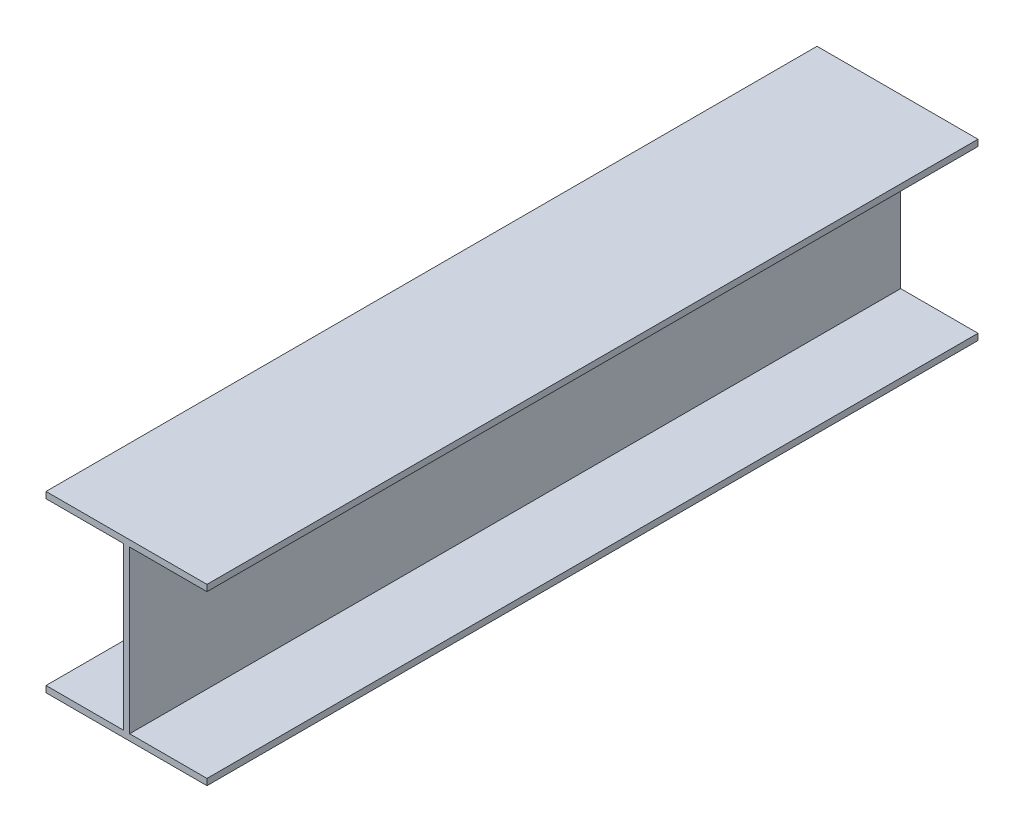
ISO-10303-21;
HEADER;
FILE_DESCRIPTION(('STEP AP214'),'2;1');
FILE_NAME('part.step','',(''),(''),'','','');
FILE_SCHEMA(('AUTOMOTIVE_DESIGN { 1 0 10303 214 1 1 1 1 }'));
ENDSEC;
DATA;
#1=APPLICATION_CONTEXT('core data for automotive mechanical design processes');
#2=APPLICATION_PROTOCOL_DEFINITION('international standard','automotive_design',2000,#1);
#3=PRODUCT_CONTEXT('',#1,'mechanical');
#4=PRODUCT('Part','Part','',(#3));
#5=PRODUCT_RELATED_PRODUCT_CATEGORY('part','',(#4));
#6=PRODUCT_DEFINITION_FORMATION('','',#4);
#7=PRODUCT_DEFINITION_CONTEXT('part definition',#1,'design');
#8=PRODUCT_DEFINITION('design','',#6,#7);
#9=PRODUCT_DEFINITION_SHAPE('','',#8);
#10=(LENGTH_UNIT() NAMED_UNIT(*) SI_UNIT(.MILLI.,.METRE.));
#11=(NAMED_UNIT(*) PLANE_ANGLE_UNIT() SI_UNIT($,.RADIAN.));
#12=(NAMED_UNIT(*) SI_UNIT($,.STERADIAN.) SOLID_ANGLE_UNIT());
#13=UNCERTAINTY_MEASURE_WITH_UNIT(LENGTH_MEASURE(1.E-05),#10,'distance_accuracy_value','');
#14=(GEOMETRIC_REPRESENTATION_CONTEXT(3) GLOBAL_UNCERTAINTY_ASSIGNED_CONTEXT((#13)) GLOBAL_UNIT_ASSIGNED_CONTEXT((#10,
#11,#12)) REPRESENTATION_CONTEXT('',''));
#15=CARTESIAN_POINT('',(0.,0.,0.));
#16=DIRECTION('',(0.,0.,1.));
#17=DIRECTION('',(1.,0.,0.));
#18=AXIS2_PLACEMENT_3D('',#15,#16,#17);
#19=CARTESIAN_POINT('',(0.,-76.55,730.));
#20=DIRECTION('',(0.,1.,0.));
#21=DIRECTION('',(0.,0.,1.));
#22=AXIS2_PLACEMENT_3D('',#19,#20,#21);
#23=PLANE('',#22);
#24=DIRECTION('',(1.,0.,0.));
#25=VECTOR('',#24,1.);
#26=CARTESIAN_POINT('',(0.,-76.55,0.));
#27=LINE('',#26,#25);
#28=CARTESIAN_POINT('',(2.99999999999993,-76.55,0.));
#29=VERTEX_POINT('',#28);
#30=CARTESIAN_POINT('',(76.2,-76.55,0.));
#31=VERTEX_POINT('',#30);
#32=EDGE_CURVE('E150',#29,#31,#27,.T.);
#33=ORIENTED_EDGE('',*,*,#32,.F.);
#34=DIRECTION('',(0.,0.,-1.));
#35=VECTOR('',#34,1.);
#36=CARTESIAN_POINT('',(2.99999999999993,-76.55,730.));
#37=LINE('',#36,#35);
#38=CARTESIAN_POINT('',(2.99999999999993,-76.55,730.));
#39=VERTEX_POINT('',#38);
#40=EDGE_CURVE('E11',#39,#29,#37,.T.);
#41=ORIENTED_EDGE('',*,*,#40,.F.);
#42=DIRECTION('',(1.,0.,0.));
#43=VECTOR('',#42,1.);
#44=CARTESIAN_POINT('',(0.,-76.55,730.));
#45=LINE('',#44,#43);
#46=CARTESIAN_POINT('',(76.2,-76.55,730.));
#47=VERTEX_POINT('',#46);
#48=EDGE_CURVE('E179',#39,#47,#45,.T.);
#49=ORIENTED_EDGE('',*,*,#48,.T.);
#50=DIRECTION('',(0.,0.,-1.));
#51=VECTOR('',#50,1.);
#52=CARTESIAN_POINT('',(76.2,-76.55,730.));
#53=LINE('',#52,#51);
#54=EDGE_CURVE('E98',#47,#31,#53,.T.);
#55=ORIENTED_EDGE('',*,*,#54,.T.);
#56=EDGE_LOOP('',(#33,#41,#49,#55));
#57=FACE_BOUND('',#56,.T.);
#58=ADVANCED_FACE('F35',(#57),#23,.T.);
#59=CARTESIAN_POINT('',(2.99999999999994,0.,730.));
#60=DIRECTION('',(1.,0.,0.));
#61=DIRECTION('',(0.,1.,0.));
#62=AXIS2_PLACEMENT_3D('',#59,#60,#61);
#63=PLANE('',#62);
#64=DIRECTION('',(0.,-1.,0.));
#65=VECTOR('',#64,1.);
#66=CARTESIAN_POINT('',(2.99999999999994,0.,0.));
#67=LINE('',#66,#65);
#68=CARTESIAN_POINT('',(2.99999999999994,76.55,0.));
#69=VERTEX_POINT('',#68);
#70=EDGE_CURVE('E153',#69,#29,#67,.T.);
#71=ORIENTED_EDGE('',*,*,#70,.F.);
#72=DIRECTION('',(0.,0.,-1.));
#73=VECTOR('',#72,1.);
#74=CARTESIAN_POINT('',(2.99999999999994,76.55,730.));
#75=LINE('',#74,#73);
#76=CARTESIAN_POINT('',(2.99999999999994,76.55,730.));
#77=VERTEX_POINT('',#76);
#78=EDGE_CURVE('E43',#77,#69,#75,.T.);
#79=ORIENTED_EDGE('',*,*,#78,.F.);
#80=DIRECTION('',(0.,-1.,0.));
#81=VECTOR('',#80,1.);
#82=CARTESIAN_POINT('',(2.99999999999994,0.,730.));
#83=LINE('',#82,#81);
#84=EDGE_CURVE('E210',#77,#39,#83,.T.);
#85=ORIENTED_EDGE('',*,*,#84,.T.);
#86=ORIENTED_EDGE('',*,*,#40,.T.);
#87=EDGE_LOOP('',(#71,#79,#85,#86));
#88=FACE_BOUND('',#87,.T.);
#89=ADVANCED_FACE('F209',(#88),#63,.T.);
#90=CARTESIAN_POINT('',(0.,76.55,730.));
#91=DIRECTION('',(0.,1.,0.));
#92=DIRECTION('',(0.,0.,1.));
#93=AXIS2_PLACEMENT_3D('',#90,#91,#92);
#94=PLANE('',#93);
#95=DIRECTION('',(1.,0.,0.));
#96=VECTOR('',#95,1.);
#97=CARTESIAN_POINT('',(0.,76.55,0.));
#98=LINE('',#97,#96);
#99=CARTESIAN_POINT('',(76.2,76.55,0.));
#100=VERTEX_POINT('',#99);
#101=EDGE_CURVE('E156',#69,#100,#98,.T.);
#102=ORIENTED_EDGE('',*,*,#101,.T.);
#103=DIRECTION('',(0.,0.,-1.));
#104=VECTOR('',#103,1.);
#105=CARTESIAN_POINT('',(76.2,76.55,730.));
#106=LINE('',#105,#104);
#107=CARTESIAN_POINT('',(76.2,76.55,730.));
#108=VERTEX_POINT('',#107);
#109=EDGE_CURVE('E195',#108,#100,#106,.T.);
#110=ORIENTED_EDGE('',*,*,#109,.F.);
#111=DIRECTION('',(1.,0.,0.));
#112=VECTOR('',#111,1.);
#113=CARTESIAN_POINT('',(0.,76.55,730.));
#114=LINE('',#113,#112);
#115=EDGE_CURVE('E201',#77,#108,#114,.T.);
#116=ORIENTED_EDGE('',*,*,#115,.F.);
#117=ORIENTED_EDGE('',*,*,#78,.T.);
#118=EDGE_LOOP('',(#102,#110,#116,#117));
#119=FACE_BOUND('',#118,.T.);
#120=ADVANCED_FACE('F199',(#119),#94,.F.);
#121=CARTESIAN_POINT('',(76.2,0.,730.));
#122=DIRECTION('',(1.,0.,0.));
#123=DIRECTION('',(0.,0.,-1.));
#124=AXIS2_PLACEMENT_3D('',#121,#122,#123);
#125=PLANE('',#124);
#126=DIRECTION('',(0.,-1.,0.));
#127=VECTOR('',#126,1.);
#128=CARTESIAN_POINT('',(76.2,0.,0.));
#129=LINE('',#128,#127);
#130=CARTESIAN_POINT('',(76.2,82.55,0.));
#131=VERTEX_POINT('',#130);
#132=EDGE_CURVE('E159',#131,#100,#129,.T.);
#133=ORIENTED_EDGE('',*,*,#132,.F.);
#134=DIRECTION('',(0.,0.,-1.));
#135=VECTOR('',#134,1.);
#136=CARTESIAN_POINT('',(76.2,82.55,730.));
#137=LINE('',#136,#135);
#138=CARTESIAN_POINT('',(76.2,82.55,730.));
#139=VERTEX_POINT('',#138);
#140=EDGE_CURVE('E193',#139,#131,#137,.T.);
#141=ORIENTED_EDGE('',*,*,#140,.F.);
#142=DIRECTION('',(0.,-1.,0.));
#143=VECTOR('',#142,1.);
#144=CARTESIAN_POINT('',(76.2,0.,730.));
#145=LINE('',#144,#143);
#146=EDGE_CURVE('E218',#139,#108,#145,.T.);
#147=ORIENTED_EDGE('',*,*,#146,.T.);
#148=ORIENTED_EDGE('',*,*,#109,.T.);
#149=EDGE_LOOP('',(#133,#141,#147,#148));
#150=FACE_BOUND('',#149,.T.);
#151=ADVANCED_FACE('F253',(#150),#125,.T.);
#152=CARTESIAN_POINT('',(0.,82.55,730.));
#153=DIRECTION('',(0.,1.,0.));
#154=DIRECTION('',(0.,0.,1.));
#155=AXIS2_PLACEMENT_3D('',#152,#153,#154);
#156=PLANE('',#155);
#157=DIRECTION('',(1.,0.,0.));
#158=VECTOR('',#157,1.);
#159=CARTESIAN_POINT('',(0.,82.55,0.));
#160=LINE('',#159,#158);
#161=CARTESIAN_POINT('',(-76.2,82.55,0.));
#162=VERTEX_POINT('',#161);
#163=EDGE_CURVE('E162',#162,#131,#160,.T.);
#164=ORIENTED_EDGE('',*,*,#163,.F.);
#165=DIRECTION('',(0.,0.,-1.));
#166=VECTOR('',#165,1.);
#167=CARTESIAN_POINT('',(-76.2,82.55,730.));
#168=LINE('',#167,#166);
#169=CARTESIAN_POINT('',(-76.2,82.55,730.));
#170=VERTEX_POINT('',#169);
#171=EDGE_CURVE('E191',#170,#162,#168,.T.);
#172=ORIENTED_EDGE('',*,*,#171,.F.);
#173=DIRECTION('',(1.,0.,0.));
#174=VECTOR('',#173,1.);
#175=CARTESIAN_POINT('',(0.,82.55,730.));
#176=LINE('',#175,#174);
#177=EDGE_CURVE('E221',#170,#139,#176,.T.);
#178=ORIENTED_EDGE('',*,*,#177,.T.);
#179=ORIENTED_EDGE('',*,*,#140,.T.);
#180=EDGE_LOOP('',(#164,#172,#178,#179));
#181=FACE_BOUND('',#180,.T.);
#182=ADVANCED_FACE('F250',(#181),#156,.T.);
#183=CARTESIAN_POINT('',(-76.2,0.,730.));
#184=DIRECTION('',(1.,0.,0.));
#185=DIRECTION('',(0.,0.,-1.));
#186=AXIS2_PLACEMENT_3D('',#183,#184,#185);
#187=PLANE('',#186);
#188=DIRECTION('',(0.,-1.,0.));
#189=VECTOR('',#188,1.);
#190=CARTESIAN_POINT('',(-76.2,0.,0.));
#191=LINE('',#190,#189);
#192=CARTESIAN_POINT('',(-76.2,76.55,0.));
#193=VERTEX_POINT('',#192);
#194=EDGE_CURVE('E165',#162,#193,#191,.T.);
#195=ORIENTED_EDGE('',*,*,#194,.T.);
#196=DIRECTION('',(0.,0.,-1.));
#197=VECTOR('',#196,1.);
#198=CARTESIAN_POINT('',(-76.2,76.55,730.));
#199=LINE('',#198,#197);
#200=CARTESIAN_POINT('',(-76.2,76.55,730.));
#201=VERTEX_POINT('',#200);
#202=EDGE_CURVE('E188',#201,#193,#199,.T.);
#203=ORIENTED_EDGE('',*,*,#202,.F.);
#204=DIRECTION('',(0.,-1.,0.));
#205=VECTOR('',#204,1.);
#206=CARTESIAN_POINT('',(-76.2,0.,730.));
#207=LINE('',#206,#205);
#208=EDGE_CURVE('E224',#170,#201,#207,.T.);
#209=ORIENTED_EDGE('',*,*,#208,.F.);
#210=ORIENTED_EDGE('',*,*,#171,.T.);
#211=EDGE_LOOP('',(#195,#203,#209,#210));
#212=FACE_BOUND('',#211,.T.);
#213=ADVANCED_FACE('F246',(#212),#187,.F.);
#214=CARTESIAN_POINT('',(0.,76.55,730.));
#215=DIRECTION('',(0.,1.,0.));
#216=DIRECTION('',(0.,0.,1.));
#217=AXIS2_PLACEMENT_3D('',#214,#215,#216);
#218=PLANE('',#217);
#219=DIRECTION('',(1.,0.,0.));
#220=VECTOR('',#219,1.);
#221=CARTESIAN_POINT('',(0.,76.55,0.));
#222=LINE('',#221,#220);
#223=CARTESIAN_POINT('',(-3.00000000000006,76.55,0.));
#224=VERTEX_POINT('',#223);
#225=EDGE_CURVE('E167',#193,#224,#222,.T.);
#226=ORIENTED_EDGE('',*,*,#225,.T.);
#227=DIRECTION('',(0.,0.,-1.));
#228=VECTOR('',#227,1.);
#229=CARTESIAN_POINT('',(-3.00000000000006,76.55,730.));
#230=LINE('',#229,#228);
#231=CARTESIAN_POINT('',(-3.00000000000006,76.55,730.));
#232=VERTEX_POINT('',#231);
#233=EDGE_CURVE('E185',#232,#224,#230,.T.);
#234=ORIENTED_EDGE('',*,*,#233,.F.);
#235=DIRECTION('',(1.,0.,0.));
#236=VECTOR('',#235,1.);
#237=CARTESIAN_POINT('',(0.,76.55,730.));
#238=LINE('',#237,#236);
#239=EDGE_CURVE('E226',#201,#232,#238,.T.);
#240=ORIENTED_EDGE('',*,*,#239,.F.);
#241=ORIENTED_EDGE('',*,*,#202,.T.);
#242=EDGE_LOOP('',(#226,#234,#240,#241));
#243=FACE_BOUND('',#242,.T.);
#244=ADVANCED_FACE('F242',(#243),#218,.F.);
#245=CARTESIAN_POINT('',(-3.00000000000006,0.,730.));
#246=DIRECTION('',(1.,0.,0.));
#247=DIRECTION('',(0.,1.,0.));
#248=AXIS2_PLACEMENT_3D('',#245,#246,#247);
#249=PLANE('',#248);
#250=DIRECTION('',(0.,-1.,0.));
#251=VECTOR('',#250,1.);
#252=CARTESIAN_POINT('',(-3.00000000000006,0.,0.));
#253=LINE('',#252,#251);
#254=CARTESIAN_POINT('',(-3.00000000000006,-76.55,0.));
#255=VERTEX_POINT('',#254);
#256=EDGE_CURVE('E169',#224,#255,#253,.T.);
#257=ORIENTED_EDGE('',*,*,#256,.T.);
#258=DIRECTION('',(0.,0.,-1.));
#259=VECTOR('',#258,1.);
#260=CARTESIAN_POINT('',(-3.00000000000006,-76.55,730.));
#261=LINE('',#260,#259);
#262=CARTESIAN_POINT('',(-3.00000000000006,-76.55,730.));
#263=VERTEX_POINT('',#262);
#264=EDGE_CURVE('E183',#263,#255,#261,.T.);
#265=ORIENTED_EDGE('',*,*,#264,.F.);
#266=DIRECTION('',(0.,-1.,0.));
#267=VECTOR('',#266,1.);
#268=CARTESIAN_POINT('',(-3.00000000000006,0.,730.));
#269=LINE('',#268,#267);
#270=EDGE_CURVE('E228',#232,#263,#269,.T.);
#271=ORIENTED_EDGE('',*,*,#270,.F.);
#272=ORIENTED_EDGE('',*,*,#233,.T.);
#273=EDGE_LOOP('',(#257,#265,#271,#272));
#274=FACE_BOUND('',#273,.T.);
#275=ADVANCED_FACE('F237',(#274),#249,.F.);
#276=CARTESIAN_POINT('',(0.,-76.55,730.));
#277=DIRECTION('',(0.,1.,0.));
#278=DIRECTION('',(0.,0.,1.));
#279=AXIS2_PLACEMENT_3D('',#276,#277,#278);
#280=PLANE('',#279);
#281=DIRECTION('',(1.,0.,0.));
#282=VECTOR('',#281,1.);
#283=CARTESIAN_POINT('',(0.,-76.55,0.));
#284=LINE('',#283,#282);
#285=CARTESIAN_POINT('',(-76.2,-76.55,0.));
#286=VERTEX_POINT('',#285);
#287=EDGE_CURVE('E172',#286,#255,#284,.T.);
#288=ORIENTED_EDGE('',*,*,#287,.F.);
#289=DIRECTION('',(0.,0.,-1.));
#290=VECTOR('',#289,1.);
#291=CARTESIAN_POINT('',(-76.2,-76.55,730.));
#292=LINE('',#291,#290);
#293=CARTESIAN_POINT('',(-76.2,-76.55,730.));
#294=VERTEX_POINT('',#293);
#295=EDGE_CURVE('E142',#294,#286,#292,.T.);
#296=ORIENTED_EDGE('',*,*,#295,.F.);
#297=DIRECTION('',(1.,0.,0.));
#298=VECTOR('',#297,1.);
#299=CARTESIAN_POINT('',(0.,-76.55,730.));
#300=LINE('',#299,#298);
#301=EDGE_CURVE('E135',#294,#263,#300,.T.);
#302=ORIENTED_EDGE('',*,*,#301,.T.);
#303=ORIENTED_EDGE('',*,*,#264,.T.);
#304=EDGE_LOOP('',(#288,#296,#302,#303));
#305=FACE_BOUND('',#304,.T.);
#306=ADVANCED_FACE('F231',(#305),#280,.T.);
#307=CARTESIAN_POINT('',(-76.2,0.,730.));
#308=DIRECTION('',(1.,0.,0.));
#309=DIRECTION('',(0.,0.,-1.));
#310=AXIS2_PLACEMENT_3D('',#307,#308,#309);
#311=PLANE('',#310);
#312=DIRECTION('',(0.,-1.,0.));
#313=VECTOR('',#312,1.);
#314=CARTESIAN_POINT('',(-76.2,0.,0.));
#315=LINE('',#314,#313);
#316=CARTESIAN_POINT('',(-76.2,-82.55,0.));
#317=VERTEX_POINT('',#316);
#318=EDGE_CURVE('E141',#286,#317,#315,.T.);
#319=ORIENTED_EDGE('',*,*,#318,.T.);
#320=DIRECTION('',(0.,0.,-1.));
#321=VECTOR('',#320,1.);
#322=CARTESIAN_POINT('',(-76.2,-82.55,730.));
#323=LINE('',#322,#321);
#324=CARTESIAN_POINT('',(-76.2,-82.55,730.));
#325=VERTEX_POINT('',#324);
#326=EDGE_CURVE('E138',#325,#317,#323,.T.);
#327=ORIENTED_EDGE('',*,*,#326,.F.);
#328=DIRECTION('',(0.,-1.,0.));
#329=VECTOR('',#328,1.);
#330=CARTESIAN_POINT('',(-76.2,0.,730.));
#331=LINE('',#330,#329);
#332=EDGE_CURVE('E129',#294,#325,#331,.T.);
#333=ORIENTED_EDGE('',*,*,#332,.F.);
#334=ORIENTED_EDGE('',*,*,#295,.T.);
#335=EDGE_LOOP('',(#319,#327,#333,#334));
#336=FACE_BOUND('',#335,.T.);
#337=ADVANCED_FACE('F139',(#336),#311,.F.);
#338=CARTESIAN_POINT('',(0.,-82.55,730.));
#339=DIRECTION('',(0.,1.,0.));
#340=DIRECTION('',(0.,0.,1.));
#341=AXIS2_PLACEMENT_3D('',#338,#339,#340);
#342=PLANE('',#341);
#343=DIRECTION('',(1.,0.,0.));
#344=VECTOR('',#343,1.);
#345=CARTESIAN_POINT('',(0.,-82.55,0.));
#346=LINE('',#345,#344);
#347=CARTESIAN_POINT('',(76.2,-82.55,0.));
#348=VERTEX_POINT('',#347);
#349=EDGE_CURVE('E91',#317,#348,#346,.T.);
#350=ORIENTED_EDGE('',*,*,#349,.T.);
#351=DIRECTION('',(0.,0.,-1.));
#352=VECTOR('',#351,1.);
#353=CARTESIAN_POINT('',(76.2,-82.55,730.));
#354=LINE('',#353,#352);
#355=CARTESIAN_POINT('',(76.2,-82.55,730.));
#356=VERTEX_POINT('',#355);
#357=EDGE_CURVE('E143',#356,#348,#354,.T.);
#358=ORIENTED_EDGE('',*,*,#357,.F.);
#359=DIRECTION('',(1.,0.,0.));
#360=VECTOR('',#359,1.);
#361=CARTESIAN_POINT('',(0.,-82.55,730.));
#362=LINE('',#361,#360);
#363=EDGE_CURVE('E133',#325,#356,#362,.T.);
#364=ORIENTED_EDGE('',*,*,#363,.F.);
#365=ORIENTED_EDGE('',*,*,#326,.T.);
#366=EDGE_LOOP('',(#350,#358,#364,#365));
#367=FACE_BOUND('',#366,.T.);
#368=ADVANCED_FACE('F145',(#367),#342,.F.);
#369=CARTESIAN_POINT('',(76.2,0.,730.));
#370=DIRECTION('',(-1.,0.,0.));
#371=DIRECTION('',(0.,0.,1.));
#372=AXIS2_PLACEMENT_3D('',#369,#370,#371);
#373=PLANE('',#372);
#374=DIRECTION('',(0.,1.,0.));
#375=VECTOR('',#374,1.);
#376=CARTESIAN_POINT('',(76.2,0.,0.));
#377=LINE('',#376,#375);
#378=EDGE_CURVE('E177',#348,#31,#377,.T.);
#379=ORIENTED_EDGE('',*,*,#378,.T.);
#380=ORIENTED_EDGE('',*,*,#54,.F.);
#381=DIRECTION('',(0.,1.,0.));
#382=VECTOR('',#381,1.);
#383=CARTESIAN_POINT('',(76.2,0.,730.));
#384=LINE('',#383,#382);
#385=EDGE_CURVE('E51',#356,#47,#384,.T.);
#386=ORIENTED_EDGE('',*,*,#385,.F.);
#387=ORIENTED_EDGE('',*,*,#357,.T.);
#388=EDGE_LOOP('',(#379,#380,#386,#387));
#389=FACE_BOUND('',#388,.T.);
#390=ADVANCED_FACE('F213',(#389),#373,.F.);
#391=CARTESIAN_POINT('',(0.,0.,730.));
#392=DIRECTION('',(0.,0.,1.));
#393=DIRECTION('',(1.,0.,0.));
#394=AXIS2_PLACEMENT_3D('',#391,#392,#393);
#395=PLANE('',#394);
#396=ORIENTED_EDGE('',*,*,#48,.F.);
#397=ORIENTED_EDGE('',*,*,#84,.F.);
#398=ORIENTED_EDGE('',*,*,#115,.T.);
#399=ORIENTED_EDGE('',*,*,#146,.F.);
#400=ORIENTED_EDGE('',*,*,#177,.F.);
#401=ORIENTED_EDGE('',*,*,#208,.T.);
#402=ORIENTED_EDGE('',*,*,#239,.T.);
#403=ORIENTED_EDGE('',*,*,#270,.T.);
#404=ORIENTED_EDGE('',*,*,#301,.F.);
#405=ORIENTED_EDGE('',*,*,#332,.T.);
#406=ORIENTED_EDGE('',*,*,#363,.T.);
#407=ORIENTED_EDGE('',*,*,#385,.T.);
#408=EDGE_LOOP('',(#396,#397,#398,#399,#400,#401,#402,#403,#404,#405,#406,#407));
#409=FACE_BOUND('',#408,.T.);
#410=ADVANCED_FACE('F131',(#409),#395,.T.);
#411=CARTESIAN_POINT('',(0.,0.,0.));
#412=DIRECTION('',(0.,0.,1.));
#413=DIRECTION('',(1.,0.,0.));
#414=AXIS2_PLACEMENT_3D('',#411,#412,#413);
#415=PLANE('',#414);
#416=ORIENTED_EDGE('',*,*,#32,.T.);
#417=ORIENTED_EDGE('',*,*,#378,.F.);
#418=ORIENTED_EDGE('',*,*,#349,.F.);
#419=ORIENTED_EDGE('',*,*,#318,.F.);
#420=ORIENTED_EDGE('',*,*,#287,.T.);
#421=ORIENTED_EDGE('',*,*,#256,.F.);
#422=ORIENTED_EDGE('',*,*,#225,.F.);
#423=ORIENTED_EDGE('',*,*,#194,.F.);
#424=ORIENTED_EDGE('',*,*,#163,.T.);
#425=ORIENTED_EDGE('',*,*,#132,.T.);
#426=ORIENTED_EDGE('',*,*,#101,.F.);
#427=ORIENTED_EDGE('',*,*,#70,.T.);
#428=EDGE_LOOP('',(#416,#417,#418,#419,#420,#421,#422,#423,#424,#425,#426,#427));
#429=FACE_BOUND('',#428,.T.);
#430=ADVANCED_FACE('F207',(#429),#415,.F.);
#431=CLOSED_SHELL('',(#58,#89,#120,#151,#182,#213,#244,#275,#306,#337,#368,#390,#410,#430));
#432=MANIFOLD_SOLID_BREP('B2',#431);
#433=ADVANCED_BREP_SHAPE_REPRESENTATION('',(#18,#432),#14);
#434=SHAPE_DEFINITION_REPRESENTATION(#9,#433);
ENDSEC;
END-ISO-10303-21;
